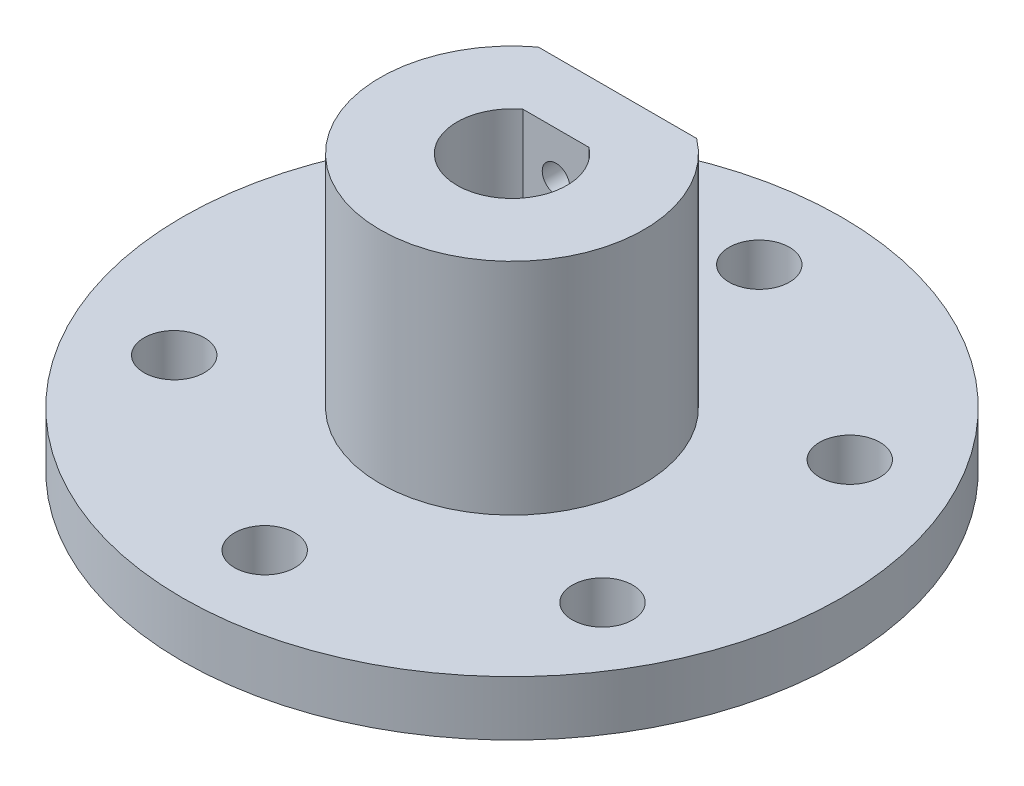
ISO-10303-21;
HEADER;
FILE_DESCRIPTION(('STEP AP214'),'2;1');
FILE_NAME('part.step','',(''),(''),'','','');
FILE_SCHEMA(('AUTOMOTIVE_DESIGN { 1 0 10303 214 1 1 1 1 }'));
ENDSEC;
DATA;
#1=APPLICATION_CONTEXT('core data for automotive mechanical design processes');
#2=APPLICATION_PROTOCOL_DEFINITION('international standard','automotive_design',2000,#1);
#3=PRODUCT_CONTEXT('',#1,'mechanical');
#4=PRODUCT('Part','Part','',(#3));
#5=PRODUCT_RELATED_PRODUCT_CATEGORY('part','',(#4));
#6=PRODUCT_DEFINITION_FORMATION('','',#4);
#7=PRODUCT_DEFINITION_CONTEXT('part definition',#1,'design');
#8=PRODUCT_DEFINITION('design','',#6,#7);
#9=PRODUCT_DEFINITION_SHAPE('','',#8);
#10=(LENGTH_UNIT() NAMED_UNIT(*) SI_UNIT(.MILLI.,.METRE.));
#11=(NAMED_UNIT(*) PLANE_ANGLE_UNIT() SI_UNIT($,.RADIAN.));
#12=(NAMED_UNIT(*) SI_UNIT($,.STERADIAN.) SOLID_ANGLE_UNIT());
#13=UNCERTAINTY_MEASURE_WITH_UNIT(LENGTH_MEASURE(1.E-05),#10,'distance_accuracy_value','');
#14=(GEOMETRIC_REPRESENTATION_CONTEXT(3) GLOBAL_UNCERTAINTY_ASSIGNED_CONTEXT((#13)) GLOBAL_UNIT_ASSIGNED_CONTEXT((#10,
#11,#12)) REPRESENTATION_CONTEXT('',''));
#15=CARTESIAN_POINT('',(0.,0.,0.));
#16=DIRECTION('',(0.,0.,1.));
#17=DIRECTION('',(1.,0.,0.));
#18=AXIS2_PLACEMENT_3D('',#15,#16,#17);
#19=CARTESIAN_POINT('',(0.,5.,0.));
#20=DIRECTION('',(0.,1.,0.));
#21=DIRECTION('',(0.,0.,1.));
#22=AXIS2_PLACEMENT_3D('',#19,#20,#21);
#23=PLANE('',#22);
#24=CARTESIAN_POINT('',(-19.4855715851489,5.,11.2500000000006));
#25=DIRECTION('',(0.,1.,0.));
#26=DIRECTION('',(0.,0.,1.));
#27=AXIS2_PLACEMENT_3D('',#24,#25,#26);
#28=CIRCLE('',#27,2.75000000000129);
#29=CARTESIAN_POINT('',(-19.4855715851489,5.,14.0000000000018));
#30=VERTEX_POINT('',#29);
#31=EDGE_CURVE('E124',#30,#30,#28,.T.);
#32=ORIENTED_EDGE('',*,*,#31,.F.);
#33=EDGE_LOOP('',(#32));
#34=FACE_BOUND('',#33,.T.);
#35=CARTESIAN_POINT('',(19.4855715851508,5.,11.2499999999994));
#36=DIRECTION('',(0.,1.,0.));
#37=DIRECTION('',(0.,0.,1.));
#38=AXIS2_PLACEMENT_3D('',#35,#36,#37);
#39=CIRCLE('',#38,2.75000000000085);
#40=CARTESIAN_POINT('',(19.4855715851508,5.,14.0000000000003));
#41=VERTEX_POINT('',#40);
#42=EDGE_CURVE('E136',#41,#41,#39,.T.);
#43=ORIENTED_EDGE('',*,*,#42,.F.);
#44=EDGE_LOOP('',(#43));
#45=FACE_BOUND('',#44,.T.);
#46=CARTESIAN_POINT('',(0.,5.,0.));
#47=DIRECTION('',(0.,1.,0.));
#48=DIRECTION('',(0.,0.,1.));
#49=AXIS2_PLACEMENT_3D('',#46,#47,#48);
#50=CIRCLE('',#49,30.);
#51=CARTESIAN_POINT('',(0.,5.,30.));
#52=VERTEX_POINT('',#51);
#53=EDGE_CURVE('E11',#52,#52,#50,.T.);
#54=ORIENTED_EDGE('',*,*,#53,.T.);
#55=EDGE_LOOP('',(#54));
#56=FACE_BOUND('',#55,.T.);
#57=CARTESIAN_POINT('',(0.,5.,-22.5));
#58=DIRECTION('',(0.,1.,0.));
#59=DIRECTION('',(0.,0.,1.));
#60=AXIS2_PLACEMENT_3D('',#57,#58,#59);
#61=CIRCLE('',#60,2.75);
#62=CARTESIAN_POINT('',(0.,5.,-19.75));
#63=VERTEX_POINT('',#62);
#64=EDGE_CURVE('E154',#63,#63,#61,.T.);
#65=ORIENTED_EDGE('',*,*,#64,.F.);
#66=EDGE_LOOP('',(#65));
#67=FACE_BOUND('',#66,.T.);
#68=CARTESIAN_POINT('',(19.4855715851499,5.,-11.25));
#69=DIRECTION('',(0.,1.,0.));
#70=DIRECTION('',(0.,0.,1.));
#71=AXIS2_PLACEMENT_3D('',#68,#69,#70);
#72=CIRCLE('',#71,2.75);
#73=CARTESIAN_POINT('',(19.4855715851499,5.,-8.49999999999996));
#74=VERTEX_POINT('',#73);
#75=EDGE_CURVE('E142',#74,#74,#72,.T.);
#76=ORIENTED_EDGE('',*,*,#75,.F.);
#77=EDGE_LOOP('',(#76));
#78=FACE_BOUND('',#77,.T.);
#79=CARTESIAN_POINT('',(1.27346601377202E-12,5.,22.5));
#80=DIRECTION('',(0.,1.,0.));
#81=DIRECTION('',(0.,0.,1.));
#82=AXIS2_PLACEMENT_3D('',#79,#80,#81);
#83=CIRCLE('',#82,2.75000000000137);
#84=CARTESIAN_POINT('',(1.27346601377202E-12,5.,25.2500000000014));
#85=VERTEX_POINT('',#84);
#86=EDGE_CURVE('E130',#85,#85,#83,.T.);
#87=ORIENTED_EDGE('',*,*,#86,.F.);
#88=EDGE_LOOP('',(#87));
#89=FACE_BOUND('',#88,.T.);
#90=CARTESIAN_POINT('',(-19.4855715851496,5.,-11.2499999999994));
#91=DIRECTION('',(0.,1.,0.));
#92=DIRECTION('',(0.,0.,1.));
#93=AXIS2_PLACEMENT_3D('',#90,#91,#92);
#94=CIRCLE('',#93,2.75000000000073);
#95=CARTESIAN_POINT('',(-19.4855715851496,5.,-8.4999999999987));
#96=VERTEX_POINT('',#95);
#97=EDGE_CURVE('E118',#96,#96,#94,.T.);
#98=ORIENTED_EDGE('',*,*,#97,.F.);
#99=EDGE_LOOP('',(#98));
#100=FACE_BOUND('',#99,.T.);
#101=DIRECTION('',(-1.,0.,0.));
#102=VECTOR('',#101,1.);
#103=CARTESIAN_POINT('',(-7.2,5.,-9.6));
#104=LINE('',#103,#102);
#105=CARTESIAN_POINT('',(7.2,5.,-9.6));
#106=VERTEX_POINT('',#105);
#107=CARTESIAN_POINT('',(-7.2,5.,-9.6));
#108=VERTEX_POINT('',#107);
#109=EDGE_CURVE('E109',#106,#108,#104,.T.);
#110=ORIENTED_EDGE('',*,*,#109,.F.);
#111=CARTESIAN_POINT('',(0.,5.,0.));
#112=DIRECTION('',(0.,1.,0.));
#113=DIRECTION('',(0.,0.,1.));
#114=AXIS2_PLACEMENT_3D('',#111,#112,#113);
#115=CIRCLE('',#114,12.);
#116=EDGE_CURVE('E53',#108,#106,#115,.T.);
#117=ORIENTED_EDGE('',*,*,#116,.F.);
#118=EDGE_LOOP('',(#110,#117));
#119=FACE_BOUND('',#118,.T.);
#120=ADVANCED_FACE('F38',(#34,#45,#56,#67,#78,#89,#100,#119),#23,.T.);
#121=CARTESIAN_POINT('',(0.,5.,0.));
#122=DIRECTION('',(0.,1.,0.));
#123=DIRECTION('',(0.,0.,1.));
#124=AXIS2_PLACEMENT_3D('',#121,#122,#123);
#125=CIRCLE('',#124,5.);
#126=CARTESIAN_POINT('',(-3.,5.,-4.));
#127=VERTEX_POINT('',#126);
#128=CARTESIAN_POINT('',(3.,5.,-4.));
#129=VERTEX_POINT('',#128);
#130=EDGE_CURVE('E94',#127,#129,#125,.T.);
#131=ORIENTED_EDGE('',*,*,#130,.T.);
#132=DIRECTION('',(-1.,0.,0.));
#133=VECTOR('',#132,1.);
#134=CARTESIAN_POINT('',(3.,5.,-4.));
#135=LINE('',#134,#133);
#136=EDGE_CURVE('E60',#129,#127,#135,.T.);
#137=ORIENTED_EDGE('',*,*,#136,.T.);
#138=EDGE_LOOP('',(#131,#137));
#139=FACE_BOUND('',#138,.T.);
#140=CARTESIAN_POINT('',(0.,5.,0.));
#141=DIRECTION('',(0.,1.,0.));
#142=DIRECTION('',(0.,0.,1.));
#143=AXIS2_PLACEMENT_3D('',#140,#141,#142);
#144=CIRCLE('',#143,2.51);
#145=CARTESIAN_POINT('',(0.,5.,2.51));
#146=VERTEX_POINT('',#145);
#147=EDGE_CURVE('E148',#146,#146,#144,.T.);
#148=ORIENTED_EDGE('',*,*,#147,.F.);
#149=EDGE_LOOP('',(#148));
#150=FACE_BOUND('',#149,.T.);
#151=ADVANCED_FACE('F178',(#139,#150),#23,.T.);
#152=CARTESIAN_POINT('',(0.,0.,0.));
#153=DIRECTION('',(0.,1.,0.));
#154=DIRECTION('',(0.,0.,1.));
#155=AXIS2_PLACEMENT_3D('',#152,#153,#154);
#156=PLANE('',#155);
#157=CARTESIAN_POINT('',(0.,0.,0.));
#158=DIRECTION('',(0.,1.,0.));
#159=DIRECTION('',(0.,0.,1.));
#160=AXIS2_PLACEMENT_3D('',#157,#158,#159);
#161=CIRCLE('',#160,30.);
#162=CARTESIAN_POINT('',(0.,0.,30.));
#163=VERTEX_POINT('',#162);
#164=EDGE_CURVE('E42',#163,#163,#161,.T.);
#165=ORIENTED_EDGE('',*,*,#164,.F.);
#166=EDGE_LOOP('',(#165));
#167=FACE_BOUND('',#166,.T.);
#168=CARTESIAN_POINT('',(0.,0.,-22.5));
#169=DIRECTION('',(0.,1.,0.));
#170=DIRECTION('',(0.,0.,1.));
#171=AXIS2_PLACEMENT_3D('',#168,#169,#170);
#172=CIRCLE('',#171,2.75);
#173=CARTESIAN_POINT('',(0.,0.,-19.75));
#174=VERTEX_POINT('',#173);
#175=EDGE_CURVE('E151',#174,#174,#172,.T.);
#176=ORIENTED_EDGE('',*,*,#175,.T.);
#177=EDGE_LOOP('',(#176));
#178=FACE_BOUND('',#177,.T.);
#179=CARTESIAN_POINT('',(0.,0.,0.));
#180=DIRECTION('',(0.,1.,0.));
#181=DIRECTION('',(0.,0.,1.));
#182=AXIS2_PLACEMENT_3D('',#179,#180,#181);
#183=CIRCLE('',#182,2.51);
#184=CARTESIAN_POINT('',(0.,0.,2.51));
#185=VERTEX_POINT('',#184);
#186=EDGE_CURVE('E145',#185,#185,#183,.T.);
#187=ORIENTED_EDGE('',*,*,#186,.T.);
#188=EDGE_LOOP('',(#187));
#189=FACE_BOUND('',#188,.T.);
#190=CARTESIAN_POINT('',(19.4855715851499,0.,-11.25));
#191=DIRECTION('',(0.,1.,0.));
#192=DIRECTION('',(0.,0.,1.));
#193=AXIS2_PLACEMENT_3D('',#190,#191,#192);
#194=CIRCLE('',#193,2.75);
#195=CARTESIAN_POINT('',(19.4855715851499,0.,-8.49999999999996));
#196=VERTEX_POINT('',#195);
#197=EDGE_CURVE('E139',#196,#196,#194,.T.);
#198=ORIENTED_EDGE('',*,*,#197,.T.);
#199=EDGE_LOOP('',(#198));
#200=FACE_BOUND('',#199,.T.);
#201=CARTESIAN_POINT('',(19.4855715851508,0.,11.2499999999994));
#202=DIRECTION('',(0.,1.,0.));
#203=DIRECTION('',(0.,0.,1.));
#204=AXIS2_PLACEMENT_3D('',#201,#202,#203);
#205=CIRCLE('',#204,2.75000000000085);
#206=CARTESIAN_POINT('',(19.4855715851508,0.,14.0000000000003));
#207=VERTEX_POINT('',#206);
#208=EDGE_CURVE('E133',#207,#207,#205,.T.);
#209=ORIENTED_EDGE('',*,*,#208,.T.);
#210=EDGE_LOOP('',(#209));
#211=FACE_BOUND('',#210,.T.);
#212=CARTESIAN_POINT('',(1.27346601377202E-12,0.,22.5));
#213=DIRECTION('',(0.,1.,0.));
#214=DIRECTION('',(0.,0.,1.));
#215=AXIS2_PLACEMENT_3D('',#212,#213,#214);
#216=CIRCLE('',#215,2.75000000000137);
#217=CARTESIAN_POINT('',(1.27346601377202E-12,0.,25.2500000000014));
#218=VERTEX_POINT('',#217);
#219=EDGE_CURVE('E127',#218,#218,#216,.T.);
#220=ORIENTED_EDGE('',*,*,#219,.T.);
#221=EDGE_LOOP('',(#220));
#222=FACE_BOUND('',#221,.T.);
#223=CARTESIAN_POINT('',(-19.4855715851489,0.,11.2500000000006));
#224=DIRECTION('',(0.,1.,0.));
#225=DIRECTION('',(0.,0.,1.));
#226=AXIS2_PLACEMENT_3D('',#223,#224,#225);
#227=CIRCLE('',#226,2.75000000000129);
#228=CARTESIAN_POINT('',(-19.4855715851489,0.,14.0000000000018));
#229=VERTEX_POINT('',#228);
#230=EDGE_CURVE('E121',#229,#229,#227,.T.);
#231=ORIENTED_EDGE('',*,*,#230,.T.);
#232=EDGE_LOOP('',(#231));
#233=FACE_BOUND('',#232,.T.);
#234=CARTESIAN_POINT('',(-19.4855715851496,0.,-11.2499999999994));
#235=DIRECTION('',(0.,1.,0.));
#236=DIRECTION('',(0.,0.,1.));
#237=AXIS2_PLACEMENT_3D('',#234,#235,#236);
#238=CIRCLE('',#237,2.75000000000073);
#239=CARTESIAN_POINT('',(-19.4855715851496,0.,-8.4999999999987));
#240=VERTEX_POINT('',#239);
#241=EDGE_CURVE('E117',#240,#240,#238,.T.);
#242=ORIENTED_EDGE('',*,*,#241,.T.);
#243=EDGE_LOOP('',(#242));
#244=FACE_BOUND('',#243,.T.);
#245=ADVANCED_FACE('F160',(#167,#178,#189,#200,#211,#222,#233,#244),#156,.F.);
#246=CARTESIAN_POINT('',(0.,5.,0.));
#247=DIRECTION('',(0.,-1.,0.));
#248=DIRECTION('',(0.,0.,-1.));
#249=AXIS2_PLACEMENT_3D('',#246,#247,#248);
#250=CYLINDRICAL_SURFACE('',#249,30.);
#251=ORIENTED_EDGE('',*,*,#53,.F.);
#252=EDGE_LOOP('',(#251));
#253=FACE_BOUND('',#252,.T.);
#254=ORIENTED_EDGE('',*,*,#164,.T.);
#255=EDGE_LOOP('',(#254));
#256=FACE_BOUND('',#255,.T.);
#257=ADVANCED_FACE('F40',(#253,#256),#250,.T.);
#258=CARTESIAN_POINT('',(0.,5.,-22.5));
#259=DIRECTION('',(0.,-1.,0.));
#260=DIRECTION('',(0.,0.,-1.));
#261=AXIS2_PLACEMENT_3D('',#258,#259,#260);
#262=CYLINDRICAL_SURFACE('',#261,2.75);
#263=ORIENTED_EDGE('',*,*,#64,.T.);
#264=EDGE_LOOP('',(#263));
#265=FACE_BOUND('',#264,.T.);
#266=ORIENTED_EDGE('',*,*,#175,.F.);
#267=EDGE_LOOP('',(#266));
#268=FACE_BOUND('',#267,.T.);
#269=ADVANCED_FACE('F163',(#265,#268),#262,.F.);
#270=CARTESIAN_POINT('',(0.,5.,0.));
#271=DIRECTION('',(0.,-1.,0.));
#272=DIRECTION('',(0.,0.,-1.));
#273=AXIS2_PLACEMENT_3D('',#270,#271,#272);
#274=CYLINDRICAL_SURFACE('',#273,2.51);
#275=ORIENTED_EDGE('',*,*,#147,.T.);
#276=EDGE_LOOP('',(#275));
#277=FACE_BOUND('',#276,.T.);
#278=ORIENTED_EDGE('',*,*,#186,.F.);
#279=EDGE_LOOP('',(#278));
#280=FACE_BOUND('',#279,.T.);
#281=ADVANCED_FACE('F165',(#277,#280),#274,.F.);
#282=CARTESIAN_POINT('',(19.4855715851499,5.,-11.25));
#283=DIRECTION('',(0.,-1.,0.));
#284=DIRECTION('',(0.,0.,-1.));
#285=AXIS2_PLACEMENT_3D('',#282,#283,#284);
#286=CYLINDRICAL_SURFACE('',#285,2.75);
#287=ORIENTED_EDGE('',*,*,#75,.T.);
#288=EDGE_LOOP('',(#287));
#289=FACE_BOUND('',#288,.T.);
#290=ORIENTED_EDGE('',*,*,#197,.F.);
#291=EDGE_LOOP('',(#290));
#292=FACE_BOUND('',#291,.T.);
#293=ADVANCED_FACE('F172',(#289,#292),#286,.F.);
#294=CARTESIAN_POINT('',(19.4855715851508,5.,11.2499999999994));
#295=DIRECTION('',(0.,-1.,0.));
#296=DIRECTION('',(0.,0.,-1.));
#297=AXIS2_PLACEMENT_3D('',#294,#295,#296);
#298=CYLINDRICAL_SURFACE('',#297,2.75000000000085);
#299=ORIENTED_EDGE('',*,*,#42,.T.);
#300=EDGE_LOOP('',(#299));
#301=FACE_BOUND('',#300,.T.);
#302=ORIENTED_EDGE('',*,*,#208,.F.);
#303=EDGE_LOOP('',(#302));
#304=FACE_BOUND('',#303,.T.);
#305=ADVANCED_FACE('F217',(#301,#304),#298,.F.);
#306=CARTESIAN_POINT('',(1.27346601377202E-12,5.,22.5));
#307=DIRECTION('',(0.,-1.,0.));
#308=DIRECTION('',(0.,0.,-1.));
#309=AXIS2_PLACEMENT_3D('',#306,#307,#308);
#310=CYLINDRICAL_SURFACE('',#309,2.75000000000137);
#311=ORIENTED_EDGE('',*,*,#86,.T.);
#312=EDGE_LOOP('',(#311));
#313=FACE_BOUND('',#312,.T.);
#314=ORIENTED_EDGE('',*,*,#219,.F.);
#315=EDGE_LOOP('',(#314));
#316=FACE_BOUND('',#315,.T.);
#317=ADVANCED_FACE('F227',(#313,#316),#310,.F.);
#318=CARTESIAN_POINT('',(-19.4855715851489,5.,11.2500000000006));
#319=DIRECTION('',(0.,-1.,0.));
#320=DIRECTION('',(0.,0.,-1.));
#321=AXIS2_PLACEMENT_3D('',#318,#319,#320);
#322=CYLINDRICAL_SURFACE('',#321,2.75000000000129);
#323=ORIENTED_EDGE('',*,*,#31,.T.);
#324=EDGE_LOOP('',(#323));
#325=FACE_BOUND('',#324,.T.);
#326=ORIENTED_EDGE('',*,*,#230,.F.);
#327=EDGE_LOOP('',(#326));
#328=FACE_BOUND('',#327,.T.);
#329=ADVANCED_FACE('F237',(#325,#328),#322,.F.);
#330=CARTESIAN_POINT('',(-19.4855715851496,5.,-11.2499999999994));
#331=DIRECTION('',(0.,-1.,0.));
#332=DIRECTION('',(0.,0.,-1.));
#333=AXIS2_PLACEMENT_3D('',#330,#331,#332);
#334=CYLINDRICAL_SURFACE('',#333,2.75000000000073);
#335=ORIENTED_EDGE('',*,*,#97,.T.);
#336=EDGE_LOOP('',(#335));
#337=FACE_BOUND('',#336,.T.);
#338=ORIENTED_EDGE('',*,*,#241,.F.);
#339=EDGE_LOOP('',(#338));
#340=FACE_BOUND('',#339,.T.);
#341=ADVANCED_FACE('F247',(#337,#340),#334,.F.);
#342=CARTESIAN_POINT('',(0.,25.,0.));
#343=DIRECTION('',(0.,1.,0.));
#344=DIRECTION('',(0.,0.,1.));
#345=AXIS2_PLACEMENT_3D('',#342,#343,#344);
#346=PLANE('',#345);
#347=CARTESIAN_POINT('',(0.,25.,0.));
#348=DIRECTION('',(0.,1.,0.));
#349=DIRECTION('',(0.,0.,1.));
#350=AXIS2_PLACEMENT_3D('',#347,#348,#349);
#351=CIRCLE('',#350,12.);
#352=CARTESIAN_POINT('',(-7.2,25.,-9.6));
#353=VERTEX_POINT('',#352);
#354=CARTESIAN_POINT('',(7.2,25.,-9.6));
#355=VERTEX_POINT('',#354);
#356=EDGE_CURVE('E105',#353,#355,#351,.T.);
#357=ORIENTED_EDGE('',*,*,#356,.T.);
#358=DIRECTION('',(-1.,0.,0.));
#359=VECTOR('',#358,1.);
#360=CARTESIAN_POINT('',(-7.2,25.,-9.6));
#361=LINE('',#360,#359);
#362=EDGE_CURVE('E108',#355,#353,#361,.T.);
#363=ORIENTED_EDGE('',*,*,#362,.T.);
#364=EDGE_LOOP('',(#357,#363));
#365=FACE_BOUND('',#364,.T.);
#366=DIRECTION('',(-1.,0.,0.));
#367=VECTOR('',#366,1.);
#368=CARTESIAN_POINT('',(3.,25.,-4.));
#369=LINE('',#368,#367);
#370=CARTESIAN_POINT('',(3.,25.,-4.));
#371=VERTEX_POINT('',#370);
#372=CARTESIAN_POINT('',(-3.,25.,-4.));
#373=VERTEX_POINT('',#372);
#374=EDGE_CURVE('E81',#371,#373,#369,.T.);
#375=ORIENTED_EDGE('',*,*,#374,.F.);
#376=CARTESIAN_POINT('',(0.,25.,0.));
#377=DIRECTION('',(0.,1.,0.));
#378=DIRECTION('',(0.,0.,1.));
#379=AXIS2_PLACEMENT_3D('',#376,#377,#378);
#380=CIRCLE('',#379,5.);
#381=EDGE_CURVE('E90',#373,#371,#380,.T.);
#382=ORIENTED_EDGE('',*,*,#381,.F.);
#383=EDGE_LOOP('',(#375,#382));
#384=FACE_BOUND('',#383,.T.);
#385=ADVANCED_FACE('F96',(#365,#384),#346,.T.);
#386=CARTESIAN_POINT('',(0.,25.,0.));
#387=DIRECTION('',(0.,-1.,0.));
#388=DIRECTION('',(0.,0.,-1.));
#389=AXIS2_PLACEMENT_3D('',#386,#387,#388);
#390=CYLINDRICAL_SURFACE('',#389,12.);
#391=ORIENTED_EDGE('',*,*,#116,.T.);
#392=DIRECTION('',(0.,-1.,0.));
#393=VECTOR('',#392,1.);
#394=CARTESIAN_POINT('',(7.2,25.,-9.6));
#395=LINE('',#394,#393);
#396=EDGE_CURVE('E115',#355,#106,#395,.T.);
#397=ORIENTED_EDGE('',*,*,#396,.F.);
#398=ORIENTED_EDGE('',*,*,#356,.F.);
#399=DIRECTION('',(0.,-1.,0.));
#400=VECTOR('',#399,1.);
#401=CARTESIAN_POINT('',(-7.2,25.,-9.6));
#402=LINE('',#401,#400);
#403=EDGE_CURVE('E111',#353,#108,#402,.T.);
#404=ORIENTED_EDGE('',*,*,#403,.T.);
#405=EDGE_LOOP('',(#391,#397,#398,#404));
#406=FACE_BOUND('',#405,.T.);
#407=ADVANCED_FACE('F274',(#406),#390,.T.);
#408=CARTESIAN_POINT('',(-7.2,25.,-9.6));
#409=DIRECTION('',(0.,0.,1.));
#410=DIRECTION('',(1.,0.,0.));
#411=AXIS2_PLACEMENT_3D('',#408,#409,#410);
#412=PLANE('',#411);
#413=CARTESIAN_POINT('',(0.,15.,-9.6));
#414=DIRECTION('',(0.,0.,-1.));
#415=DIRECTION('',(-1.,0.,0.));
#416=AXIS2_PLACEMENT_3D('',#413,#414,#415);
#417=CIRCLE('',#416,1.6);
#418=CARTESIAN_POINT('',(-1.6,15.,-9.6));
#419=VERTEX_POINT('',#418);
#420=EDGE_CURVE('E342',#419,#419,#417,.T.);
#421=ORIENTED_EDGE('',*,*,#420,.F.);
#422=EDGE_LOOP('',(#421));
#423=FACE_BOUND('',#422,.T.);
#424=CARTESIAN_POINT('',(0.,21.,-9.6));
#425=DIRECTION('',(0.,0.,-1.));
#426=DIRECTION('',(-1.,0.,0.));
#427=AXIS2_PLACEMENT_3D('',#424,#425,#426);
#428=CIRCLE('',#427,1.25);
#429=CARTESIAN_POINT('',(-1.25,21.,-9.6));
#430=VERTEX_POINT('',#429);
#431=EDGE_CURVE('E343',#430,#430,#428,.T.);
#432=ORIENTED_EDGE('',*,*,#431,.F.);
#433=EDGE_LOOP('',(#432));
#434=FACE_BOUND('',#433,.T.);
#435=ORIENTED_EDGE('',*,*,#109,.T.);
#436=ORIENTED_EDGE('',*,*,#403,.F.);
#437=ORIENTED_EDGE('',*,*,#362,.F.);
#438=ORIENTED_EDGE('',*,*,#396,.T.);
#439=EDGE_LOOP('',(#435,#436,#437,#438));
#440=FACE_BOUND('',#439,.T.);
#441=ADVANCED_FACE('F284',(#423,#434,#440),#412,.F.);
#442=CARTESIAN_POINT('',(0.,25.,0.));
#443=DIRECTION('',(0.,-1.,0.));
#444=DIRECTION('',(0.,0.,-1.));
#445=AXIS2_PLACEMENT_3D('',#442,#443,#444);
#446=CYLINDRICAL_SURFACE('',#445,5.);
#447=ORIENTED_EDGE('',*,*,#130,.F.);
#448=DIRECTION('',(0.,-1.,0.));
#449=VECTOR('',#448,1.);
#450=CARTESIAN_POINT('',(-3.,25.,-4.));
#451=LINE('',#450,#449);
#452=EDGE_CURVE('E84',#373,#127,#451,.T.);
#453=ORIENTED_EDGE('',*,*,#452,.F.);
#454=ORIENTED_EDGE('',*,*,#381,.T.);
#455=DIRECTION('',(0.,-1.,0.));
#456=VECTOR('',#455,1.);
#457=CARTESIAN_POINT('',(3.,25.,-4.));
#458=LINE('',#457,#456);
#459=EDGE_CURVE('E86',#371,#129,#458,.T.);
#460=ORIENTED_EDGE('',*,*,#459,.T.);
#461=EDGE_LOOP('',(#447,#453,#454,#460));
#462=FACE_BOUND('',#461,.T.);
#463=ADVANCED_FACE('F93',(#462),#446,.F.);
#464=CARTESIAN_POINT('',(3.,25.,-4.));
#465=DIRECTION('',(0.,0.,1.));
#466=DIRECTION('',(1.,0.,0.));
#467=AXIS2_PLACEMENT_3D('',#464,#465,#466);
#468=PLANE('',#467);
#469=CARTESIAN_POINT('',(0.,15.,-4.));
#470=DIRECTION('',(0.,0.,1.));
#471=DIRECTION('',(1.,0.,0.));
#472=AXIS2_PLACEMENT_3D('',#469,#470,#471);
#473=CIRCLE('',#472,1.6);
#474=CARTESIAN_POINT('',(1.6,15.,-4.));
#475=VERTEX_POINT('',#474);
#476=EDGE_CURVE('E339',#475,#475,#473,.F.);
#477=ORIENTED_EDGE('',*,*,#476,.T.);
#478=EDGE_LOOP('',(#477));
#479=FACE_BOUND('',#478,.T.);
#480=CARTESIAN_POINT('',(0.,21.,-4.));
#481=DIRECTION('',(0.,0.,1.));
#482=DIRECTION('',(1.,0.,0.));
#483=AXIS2_PLACEMENT_3D('',#480,#481,#482);
#484=CIRCLE('',#483,1.25);
#485=CARTESIAN_POINT('',(1.25,21.,-4.));
#486=VERTEX_POINT('',#485);
#487=EDGE_CURVE('E100',#486,#486,#484,.T.);
#488=ORIENTED_EDGE('',*,*,#487,.F.);
#489=EDGE_LOOP('',(#488));
#490=FACE_BOUND('',#489,.T.);
#491=ORIENTED_EDGE('',*,*,#136,.F.);
#492=ORIENTED_EDGE('',*,*,#459,.F.);
#493=ORIENTED_EDGE('',*,*,#374,.T.);
#494=ORIENTED_EDGE('',*,*,#452,.T.);
#495=EDGE_LOOP('',(#491,#492,#493,#494));
#496=FACE_BOUND('',#495,.T.);
#497=ADVANCED_FACE('F83',(#479,#490,#496),#468,.T.);
#498=CARTESIAN_POINT('',(0.,21.,-9.6));
#499=DIRECTION('',(0.,0.,-1.));
#500=DIRECTION('',(-1.,0.,0.));
#501=AXIS2_PLACEMENT_3D('',#498,#499,#500);
#502=CYLINDRICAL_SURFACE('',#501,1.25);
#503=ORIENTED_EDGE('',*,*,#431,.T.);
#504=EDGE_LOOP('',(#503));
#505=FACE_BOUND('',#504,.T.);
#506=ORIENTED_EDGE('',*,*,#487,.T.);
#507=EDGE_LOOP('',(#506));
#508=FACE_BOUND('',#507,.T.);
#509=ADVANCED_FACE('F301',(#505,#508),#502,.F.);
#510=CARTESIAN_POINT('',(0.,15.,30.001));
#511=DIRECTION('',(0.,0.,-1.));
#512=DIRECTION('',(-1.,0.,0.));
#513=AXIS2_PLACEMENT_3D('',#510,#511,#512);
#514=CYLINDRICAL_SURFACE('',#513,1.6);
#515=ORIENTED_EDGE('',*,*,#476,.F.);
#516=EDGE_LOOP('',(#515));
#517=FACE_BOUND('',#516,.T.);
#518=ORIENTED_EDGE('',*,*,#420,.T.);
#519=EDGE_LOOP('',(#518));
#520=FACE_BOUND('',#519,.T.);
#521=ADVANCED_FACE('F307',(#517,#520),#514,.F.);
#522=CLOSED_SHELL('',(#120,#151,#245,#257,#269,#281,#293,#305,#317,#329,#341,#385,#407,#441,
#463,#497,#509,#521));
#523=MANIFOLD_SOLID_BREP('B2',#522);
#524=ADVANCED_BREP_SHAPE_REPRESENTATION('',(#18,#523),#14);
#525=SHAPE_DEFINITION_REPRESENTATION(#9,#524);
ENDSEC;
END-ISO-10303-21;
